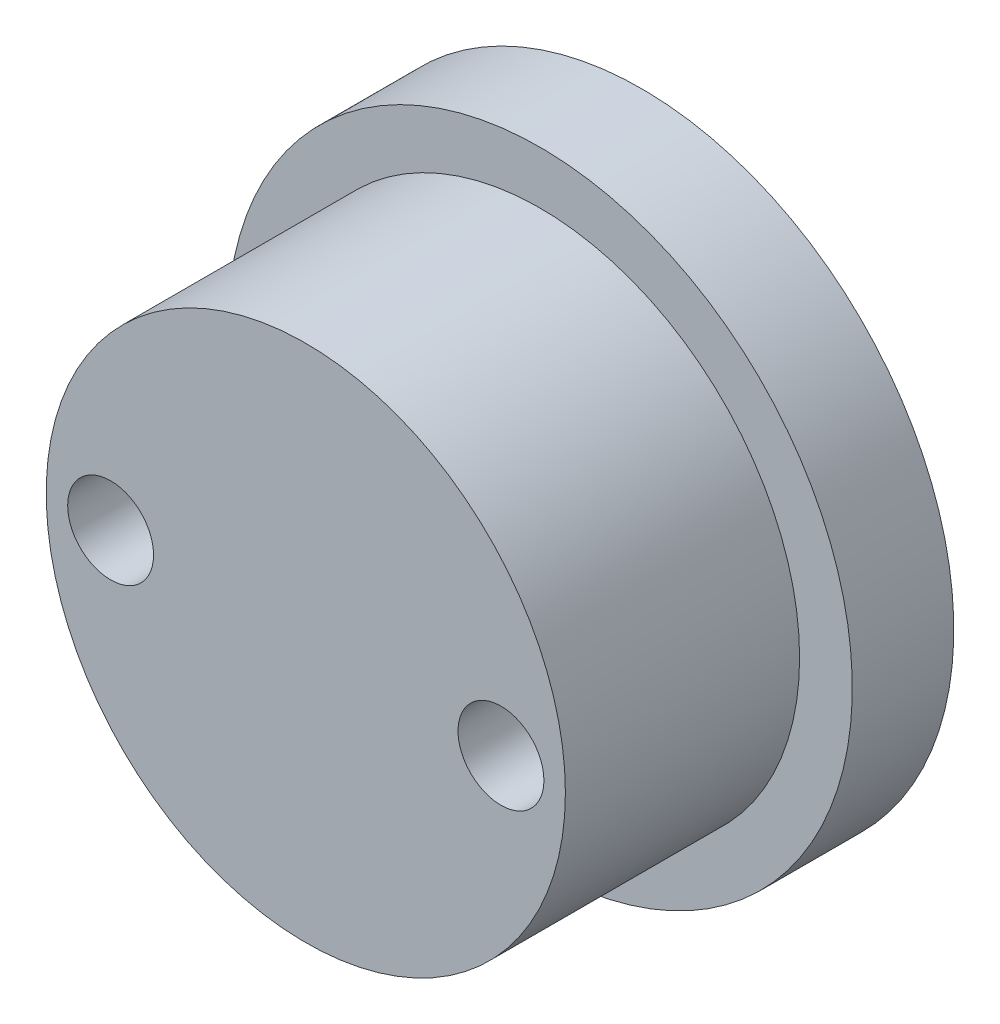
ISO-10303-21;
HEADER;
FILE_DESCRIPTION(('STEP AP214'),'2;1');
FILE_NAME('part.step','',(''),(''),'','','');
FILE_SCHEMA(('AUTOMOTIVE_DESIGN { 1 0 10303 214 1 1 1 1 }'));
ENDSEC;
DATA;
#1=APPLICATION_CONTEXT('core data for automotive mechanical design processes');
#2=APPLICATION_PROTOCOL_DEFINITION('international standard','automotive_design',2000,#1);
#3=PRODUCT_CONTEXT('',#1,'mechanical');
#4=PRODUCT('Part','Part','',(#3));
#5=PRODUCT_RELATED_PRODUCT_CATEGORY('part','',(#4));
#6=PRODUCT_DEFINITION_FORMATION('','',#4);
#7=PRODUCT_DEFINITION_CONTEXT('part definition',#1,'design');
#8=PRODUCT_DEFINITION('design','',#6,#7);
#9=PRODUCT_DEFINITION_SHAPE('','',#8);
#10=(LENGTH_UNIT() NAMED_UNIT(*) SI_UNIT(.MILLI.,.METRE.));
#11=(NAMED_UNIT(*) PLANE_ANGLE_UNIT() SI_UNIT($,.RADIAN.));
#12=(NAMED_UNIT(*) SI_UNIT($,.STERADIAN.) SOLID_ANGLE_UNIT());
#13=UNCERTAINTY_MEASURE_WITH_UNIT(LENGTH_MEASURE(1.E-05),#10,'distance_accuracy_value','');
#14=(GEOMETRIC_REPRESENTATION_CONTEXT(3) GLOBAL_UNCERTAINTY_ASSIGNED_CONTEXT((#13)) GLOBAL_UNIT_ASSIGNED_CONTEXT((#10,
#11,#12)) REPRESENTATION_CONTEXT('',''));
#15=CARTESIAN_POINT('',(0.,0.,0.));
#16=DIRECTION('',(0.,0.,1.));
#17=DIRECTION('',(1.,0.,0.));
#18=AXIS2_PLACEMENT_3D('',#15,#16,#17);
#19=CARTESIAN_POINT('',(0.,0.,12.9));
#20=DIRECTION('',(0.,0.,-1.));
#21=DIRECTION('',(-1.,0.,0.));
#22=AXIS2_PLACEMENT_3D('',#19,#20,#21);
#23=CYLINDRICAL_SURFACE('',#22,12.);
#24=CARTESIAN_POINT('',(0.,0.,0.));
#25=DIRECTION('',(0.,0.,1.));
#26=DIRECTION('',(1.,0.,0.));
#27=AXIS2_PLACEMENT_3D('',#24,#25,#26);
#28=CIRCLE('',#27,12.);
#29=CARTESIAN_POINT('',(-12.,0.,0.));
#30=VERTEX_POINT('',#29);
#31=EDGE_CURVE('E10',#30,#30,#28,.T.);
#32=CARTESIAN_POINT('',(0.,0.,3.9));
#33=DIRECTION('',(0.,0.,1.));
#34=DIRECTION('',(1.,0.,0.));
#35=AXIS2_PLACEMENT_3D('',#32,#33,#34);
#36=CIRCLE('',#35,12.);
#37=CARTESIAN_POINT('',(-12.,0.,3.9));
#38=VERTEX_POINT('',#37);
#39=EDGE_CURVE('E36',#38,#38,#36,.T.);
#40=CARTESIAN_POINT('',(-12.,0.,0.));
#41=CARTESIAN_POINT('',(-12.,0.,0.0406250000000002));
#42=CARTESIAN_POINT('',(-12.,0.,0.0812500000000003));
#43=CARTESIAN_POINT('',(-12.,0.,0.162500000000001));
#44=CARTESIAN_POINT('',(-12.,0.,0.203125000000001));
#45=CARTESIAN_POINT('',(-12.,0.,0.284375));
#46=CARTESIAN_POINT('',(-12.,0.,0.325));
#47=CARTESIAN_POINT('',(-12.,0.,0.40625));
#48=CARTESIAN_POINT('',(-12.,0.,0.446875));
#49=CARTESIAN_POINT('',(-12.,0.,0.528125));
#50=CARTESIAN_POINT('',(-12.,0.,0.56875));
#51=CARTESIAN_POINT('',(-12.,0.,0.65));
#52=CARTESIAN_POINT('',(-12.,0.,0.690625));
#53=CARTESIAN_POINT('',(-12.,0.,0.771874999999999));
#54=CARTESIAN_POINT('',(-12.,0.,0.8125));
#55=CARTESIAN_POINT('',(-12.,0.,0.89375));
#56=CARTESIAN_POINT('',(-12.,0.,0.934375));
#57=CARTESIAN_POINT('',(-12.,0.,1.015625));
#58=CARTESIAN_POINT('',(-12.,0.,1.05625));
#59=CARTESIAN_POINT('',(-12.,0.,1.1375));
#60=CARTESIAN_POINT('',(-12.,0.,1.178125));
#61=CARTESIAN_POINT('',(-12.,0.,1.259375));
#62=CARTESIAN_POINT('',(-12.,0.,1.3));
#63=CARTESIAN_POINT('',(-12.,0.,1.38125));
#64=CARTESIAN_POINT('',(-12.,0.,1.421875));
#65=CARTESIAN_POINT('',(-12.,0.,1.503125));
#66=CARTESIAN_POINT('',(-12.,0.,1.54375));
#67=CARTESIAN_POINT('',(-12.,0.,1.625));
#68=CARTESIAN_POINT('',(-12.,0.,1.665625));
#69=CARTESIAN_POINT('',(-12.,0.,1.746875));
#70=CARTESIAN_POINT('',(-12.,0.,1.7875));
#71=CARTESIAN_POINT('',(-12.,0.,1.86875));
#72=CARTESIAN_POINT('',(-12.,0.,1.909375));
#73=CARTESIAN_POINT('',(-12.,0.,1.990625));
#74=CARTESIAN_POINT('',(-12.,0.,2.03125));
#75=CARTESIAN_POINT('',(-12.,0.,2.1125));
#76=CARTESIAN_POINT('',(-12.,0.,2.153125));
#77=CARTESIAN_POINT('',(-12.,0.,2.234375));
#78=CARTESIAN_POINT('',(-12.,0.,2.275));
#79=CARTESIAN_POINT('',(-12.,0.,2.35625));
#80=CARTESIAN_POINT('',(-12.,0.,2.396875));
#81=CARTESIAN_POINT('',(-12.,0.,2.478125));
#82=CARTESIAN_POINT('',(-12.,0.,2.51875));
#83=CARTESIAN_POINT('',(-12.,0.,2.6));
#84=CARTESIAN_POINT('',(-12.,0.,2.640625));
#85=CARTESIAN_POINT('',(-12.,0.,2.721875));
#86=CARTESIAN_POINT('',(-12.,0.,2.7625));
#87=CARTESIAN_POINT('',(-12.,0.,2.84375));
#88=CARTESIAN_POINT('',(-12.,0.,2.884375));
#89=CARTESIAN_POINT('',(-12.,0.,2.965625));
#90=CARTESIAN_POINT('',(-12.,0.,3.00625));
#91=CARTESIAN_POINT('',(-12.,0.,3.0875));
#92=CARTESIAN_POINT('',(-12.,0.,3.128125));
#93=CARTESIAN_POINT('',(-12.,0.,3.209375));
#94=CARTESIAN_POINT('',(-12.,0.,3.25));
#95=CARTESIAN_POINT('',(-12.,0.,3.33125));
#96=CARTESIAN_POINT('',(-12.,0.,3.371875));
#97=CARTESIAN_POINT('',(-12.,0.,3.453125));
#98=CARTESIAN_POINT('',(-12.,0.,3.49375));
#99=CARTESIAN_POINT('',(-12.,0.,3.575));
#100=CARTESIAN_POINT('',(-12.,0.,3.615625));
#101=CARTESIAN_POINT('',(-12.,0.,3.696875));
#102=CARTESIAN_POINT('',(-12.,0.,3.7375));
#103=CARTESIAN_POINT('',(-12.,0.,3.81875));
#104=CARTESIAN_POINT('',(-12.,0.,3.859375));
#105=CARTESIAN_POINT('',(-12.,0.,3.9));
#106=B_SPLINE_CURVE_WITH_KNOTS('',3,(#40,#41,#42,#43,#44,#45,#46,#47,#48,#49,#50,#51,#52,#53,
#54,#55,#56,#57,#58,#59,#60,#61,#62,#63,#64,#65,#66,#67,#68,#69,#70,#71,#72,#73,#74,#75,#76,#77,
#78,#79,#80,#81,#82,#83,#84,#85,#86,#87,#88,#89,#90,#91,#92,#93,#94,#95,#96,#97,#98,#99,#100,
#101,#102,#103,#104,#105),.UNSPECIFIED.,.F.,.F.,(4,2,2,2,2,2,2,2,2,2,2,2,2,2,2,2,2,2,2,2,2,2,2,
2,2,2,2,2,2,2,2,2,4),(0.,0.121875,0.243750000000001,0.365625,0.4875,0.609375000000001,
0.731249999999999,0.853125,0.975,1.096875,1.21875,1.340625,1.4625,1.584375,1.70625,1.828125,
1.95,2.071875,2.19375,2.315625,2.4375,2.559375,2.68125,2.803125,2.925,3.046875,3.16875,3.290625,
3.4125,3.534375,3.65625,3.778125,3.9),.UNSPECIFIED.);
#107=EDGE_CURVE('BSEAM30',#30,#38,#106,.T.);
#108=ORIENTED_EDGE('',*,*,#31,.T.);
#109=ORIENTED_EDGE('',*,*,#39,.F.);
#110=ORIENTED_EDGE('',*,*,#107,.T.);
#111=ORIENTED_EDGE('',*,*,#107,.F.);
#112=EDGE_LOOP('',(#108,#110,#109,#111));
#113=FACE_BOUND('',#112,.T.);
#114=ADVANCED_FACE('F30',(#113),#23,.T.);
#115=CARTESIAN_POINT('',(0.,0.,0.));
#116=DIRECTION('',(0.,0.,1.));
#117=DIRECTION('',(1.,0.,0.));
#118=AXIS2_PLACEMENT_3D('',#115,#116,#117);
#119=PLANE('',#118);
#120=CARTESIAN_POINT('',(-7.5,0.,0.));
#121=DIRECTION('',(0.,0.,-1.));
#122=DIRECTION('',(-1.,0.,0.));
#123=AXIS2_PLACEMENT_3D('',#120,#121,#122);
#124=CIRCLE('',#123,1.65);
#125=CARTESIAN_POINT('',(-9.15,0.,0.));
#126=VERTEX_POINT('',#125);
#127=EDGE_CURVE('E53',#126,#126,#124,.T.);
#128=ORIENTED_EDGE('',*,*,#127,.F.);
#129=EDGE_LOOP('',(#128));
#130=FACE_BOUND('',#129,.T.);
#131=CARTESIAN_POINT('',(7.5,0.,0.));
#132=DIRECTION('',(0.,0.,-1.));
#133=DIRECTION('',(1.,0.,0.));
#134=AXIS2_PLACEMENT_3D('',#131,#132,#133);
#135=CIRCLE('',#134,1.65);
#136=CARTESIAN_POINT('',(9.15,0.,0.));
#137=VERTEX_POINT('',#136);
#138=EDGE_CURVE('E54',#137,#137,#135,.T.);
#139=ORIENTED_EDGE('',*,*,#138,.F.);
#140=EDGE_LOOP('',(#139));
#141=FACE_BOUND('',#140,.T.);
#142=ORIENTED_EDGE('',*,*,#31,.F.);
#143=EDGE_LOOP('',(#142));
#144=FACE_BOUND('',#143,.T.);
#145=ADVANCED_FACE('F65',(#130,#141,#144),#119,.F.);
#146=CARTESIAN_POINT('',(0.,0.,3.9));
#147=DIRECTION('',(0.,0.,1.));
#148=DIRECTION('',(1.,0.,0.));
#149=AXIS2_PLACEMENT_3D('',#146,#147,#148);
#150=PLANE('',#149);
#151=CARTESIAN_POINT('',(0.,0.,3.9));
#152=DIRECTION('',(0.,0.,1.));
#153=DIRECTION('',(1.,0.,0.));
#154=AXIS2_PLACEMENT_3D('',#151,#152,#153);
#155=CIRCLE('',#154,9.975);
#156=CARTESIAN_POINT('',(9.975,0.,3.9));
#157=VERTEX_POINT('',#156);
#158=EDGE_CURVE('E40',#157,#157,#155,.T.);
#159=ORIENTED_EDGE('',*,*,#158,.F.);
#160=EDGE_LOOP('',(#159));
#161=FACE_BOUND('',#160,.T.);
#162=ORIENTED_EDGE('',*,*,#39,.T.);
#163=EDGE_LOOP('',(#162));
#164=FACE_BOUND('',#163,.T.);
#165=ADVANCED_FACE('F68',(#161,#164),#150,.T.);
#166=CARTESIAN_POINT('',(0.,0.,3.9));
#167=DIRECTION('',(0.,0.,1.));
#168=DIRECTION('',(1.,0.,0.));
#169=AXIS2_PLACEMENT_3D('',#166,#167,#168);
#170=CYLINDRICAL_SURFACE('',#169,9.975);
#171=ORIENTED_EDGE('',*,*,#158,.T.);
#172=EDGE_LOOP('',(#171));
#173=FACE_BOUND('',#172,.T.);
#174=CARTESIAN_POINT('',(0.,0.,12.9));
#175=DIRECTION('',(0.,0.,1.));
#176=DIRECTION('',(1.,0.,0.));
#177=AXIS2_PLACEMENT_3D('',#174,#175,#176);
#178=CIRCLE('',#177,9.975);
#179=CARTESIAN_POINT('',(9.975,0.,12.9));
#180=VERTEX_POINT('',#179);
#181=EDGE_CURVE('E44',#180,#180,#178,.T.);
#182=ORIENTED_EDGE('',*,*,#181,.F.);
#183=EDGE_LOOP('',(#182));
#184=FACE_BOUND('',#183,.T.);
#185=ADVANCED_FACE('F81',(#173,#184),#170,.T.);
#186=CARTESIAN_POINT('',(0.,0.,12.9));
#187=DIRECTION('',(0.,0.,1.));
#188=DIRECTION('',(1.,0.,0.));
#189=AXIS2_PLACEMENT_3D('',#186,#187,#188);
#190=PLANE('',#189);
#191=CARTESIAN_POINT('',(-7.5,0.,12.9));
#192=DIRECTION('',(0.,0.,1.));
#193=DIRECTION('',(1.,0.,0.));
#194=AXIS2_PLACEMENT_3D('',#191,#192,#193);
#195=CIRCLE('',#194,1.65);
#196=CARTESIAN_POINT('',(-5.85,0.,12.9));
#197=VERTEX_POINT('',#196);
#198=EDGE_CURVE('E48',#197,#197,#195,.F.);
#199=ORIENTED_EDGE('',*,*,#198,.T.);
#200=EDGE_LOOP('',(#199));
#201=FACE_BOUND('',#200,.T.);
#202=CARTESIAN_POINT('',(7.5,0.,12.9));
#203=DIRECTION('',(0.,0.,1.));
#204=DIRECTION('',(1.,0.,0.));
#205=AXIS2_PLACEMENT_3D('',#202,#203,#204);
#206=CIRCLE('',#205,1.65);
#207=CARTESIAN_POINT('',(9.15,0.,12.9));
#208=VERTEX_POINT('',#207);
#209=EDGE_CURVE('E50',#208,#208,#206,.F.);
#210=ORIENTED_EDGE('',*,*,#209,.T.);
#211=EDGE_LOOP('',(#210));
#212=FACE_BOUND('',#211,.T.);
#213=ORIENTED_EDGE('',*,*,#181,.T.);
#214=EDGE_LOOP('',(#213));
#215=FACE_BOUND('',#214,.T.);
#216=ADVANCED_FACE('F75',(#201,#212,#215),#190,.T.);
#217=CARTESIAN_POINT('',(7.5,0.,17.5669047558312));
#218=DIRECTION('',(0.,0.,-1.));
#219=DIRECTION('',(-1.,0.,0.));
#220=AXIS2_PLACEMENT_3D('',#217,#218,#219);
#221=CYLINDRICAL_SURFACE('',#220,1.65);
#222=ORIENTED_EDGE('',*,*,#138,.T.);
#223=EDGE_LOOP('',(#222));
#224=FACE_BOUND('',#223,.T.);
#225=ORIENTED_EDGE('',*,*,#209,.F.);
#226=EDGE_LOOP('',(#225));
#227=FACE_BOUND('',#226,.T.);
#228=ADVANCED_FACE('F72',(#224,#227),#221,.F.);
#229=CARTESIAN_POINT('',(-7.5,0.,17.5669047558312));
#230=DIRECTION('',(0.,0.,-1.));
#231=DIRECTION('',(-1.,0.,0.));
#232=AXIS2_PLACEMENT_3D('',#229,#230,#231);
#233=CYLINDRICAL_SURFACE('',#232,1.65);
#234=ORIENTED_EDGE('',*,*,#127,.T.);
#235=EDGE_LOOP('',(#234));
#236=FACE_BOUND('',#235,.T.);
#237=ORIENTED_EDGE('',*,*,#198,.F.);
#238=EDGE_LOOP('',(#237));
#239=FACE_BOUND('',#238,.T.);
#240=ADVANCED_FACE('F62',(#236,#239),#233,.F.);
#241=CLOSED_SHELL('',(#114,#145,#165,#185,#216,#228,#240));
#242=MANIFOLD_SOLID_BREP('B2',#241);
#243=ADVANCED_BREP_SHAPE_REPRESENTATION('',(#18,#242),#14);
#244=SHAPE_DEFINITION_REPRESENTATION(#9,#243);
ENDSEC;
END-ISO-10303-21;
